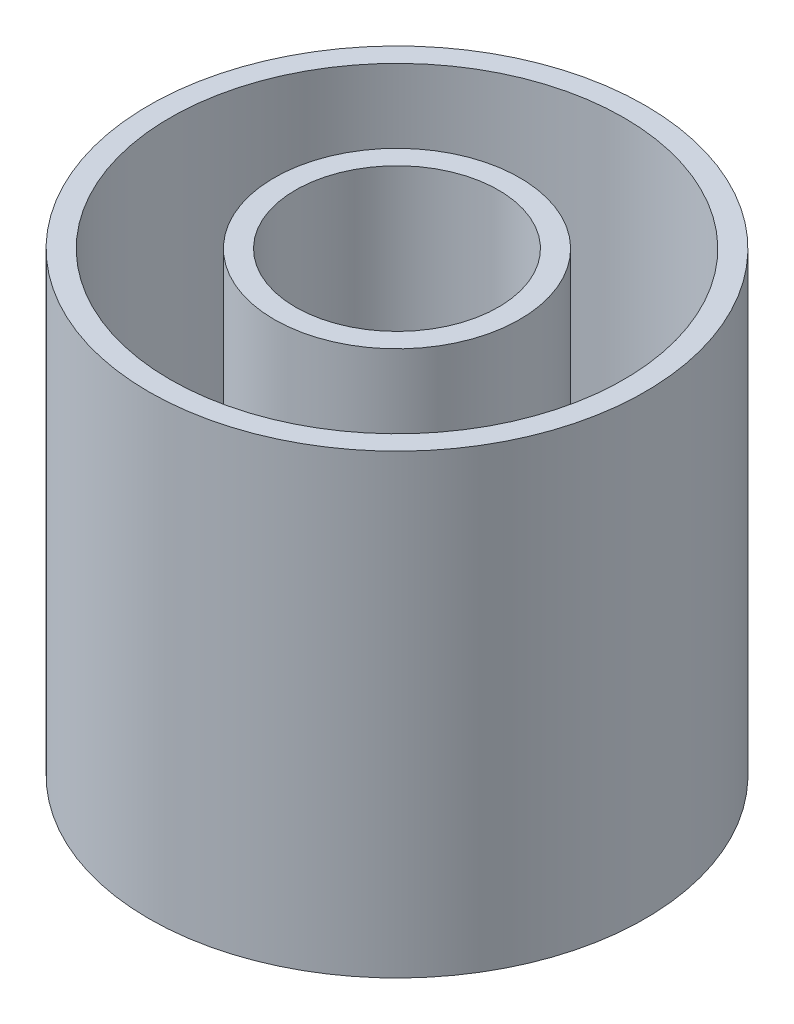
ISO-10303-21;
HEADER;
FILE_DESCRIPTION(('STEP AP214'),'2;1');
FILE_NAME('part.step','',(''),(''),'','','');
FILE_SCHEMA(('AUTOMOTIVE_DESIGN { 1 0 10303 214 1 1 1 1 }'));
ENDSEC;
DATA;
#1=APPLICATION_CONTEXT('core data for automotive mechanical design processes');
#2=APPLICATION_PROTOCOL_DEFINITION('international standard','automotive_design',2000,#1);
#3=PRODUCT_CONTEXT('',#1,'mechanical');
#4=PRODUCT('Part','Part','',(#3));
#5=PRODUCT_RELATED_PRODUCT_CATEGORY('part','',(#4));
#6=PRODUCT_DEFINITION_FORMATION('','',#4);
#7=PRODUCT_DEFINITION_CONTEXT('part definition',#1,'design');
#8=PRODUCT_DEFINITION('design','',#6,#7);
#9=PRODUCT_DEFINITION_SHAPE('','',#8);
#10=(LENGTH_UNIT() NAMED_UNIT(*) SI_UNIT(.MILLI.,.METRE.));
#11=(NAMED_UNIT(*) PLANE_ANGLE_UNIT() SI_UNIT($,.RADIAN.));
#12=(NAMED_UNIT(*) SI_UNIT($,.STERADIAN.) SOLID_ANGLE_UNIT());
#13=UNCERTAINTY_MEASURE_WITH_UNIT(LENGTH_MEASURE(1.E-05),#10,'distance_accuracy_value','');
#14=(GEOMETRIC_REPRESENTATION_CONTEXT(3) GLOBAL_UNCERTAINTY_ASSIGNED_CONTEXT((#13)) GLOBAL_UNIT_ASSIGNED_CONTEXT((#10,
#11,#12)) REPRESENTATION_CONTEXT('',''));
#15=CARTESIAN_POINT('',(0.,0.,0.));
#16=DIRECTION('',(0.,0.,1.));
#17=DIRECTION('',(1.,0.,0.));
#18=AXIS2_PLACEMENT_3D('',#15,#16,#17);
#19=CARTESIAN_POINT('',(0.,21.4122,0.));
#20=DIRECTION('',(0.,-1.,0.));
#21=DIRECTION('',(0.,0.,-1.));
#22=AXIS2_PLACEMENT_3D('',#19,#20,#21);
#23=CYLINDRICAL_SURFACE('',#22,11.6459);
#24=CARTESIAN_POINT('',(0.,21.4122,0.));
#25=DIRECTION('',(0.,1.,0.));
#26=DIRECTION('',(0.,0.,1.));
#27=AXIS2_PLACEMENT_3D('',#24,#25,#26);
#28=CIRCLE('',#27,11.6459);
#29=CARTESIAN_POINT('',(0.,21.4122,11.6459));
#30=VERTEX_POINT('',#29);
#31=EDGE_CURVE('E10',#30,#30,#28,.T.);
#32=ORIENTED_EDGE('',*,*,#31,.F.);
#33=EDGE_LOOP('',(#32));
#34=FACE_BOUND('',#33,.T.);
#35=CARTESIAN_POINT('',(0.,0.,0.));
#36=DIRECTION('',(0.,1.,0.));
#37=DIRECTION('',(0.,0.,1.));
#38=AXIS2_PLACEMENT_3D('',#35,#36,#37);
#39=CIRCLE('',#38,11.6459);
#40=CARTESIAN_POINT('',(0.,0.,11.6459));
#41=VERTEX_POINT('',#40);
#42=EDGE_CURVE('E36',#41,#41,#39,.T.);
#43=ORIENTED_EDGE('',*,*,#42,.T.);
#44=EDGE_LOOP('',(#43));
#45=FACE_BOUND('',#44,.T.);
#46=ADVANCED_FACE('F33',(#34,#45),#23,.T.);
#47=CARTESIAN_POINT('',(0.,21.4122,0.));
#48=DIRECTION('',(0.,1.,0.));
#49=DIRECTION('',(0.,0.,1.));
#50=AXIS2_PLACEMENT_3D('',#47,#48,#49);
#51=PLANE('',#50);
#52=CARTESIAN_POINT('',(0.,21.4122,0.));
#53=DIRECTION('',(0.,1.,0.));
#54=DIRECTION('',(0.,0.,1.));
#55=AXIS2_PLACEMENT_3D('',#52,#53,#54);
#56=CIRCLE('',#55,10.6459);
#57=CARTESIAN_POINT('',(0.,21.4122,10.6459));
#58=VERTEX_POINT('',#57);
#59=EDGE_CURVE('E51',#58,#58,#56,.T.);
#60=ORIENTED_EDGE('',*,*,#59,.F.);
#61=EDGE_LOOP('',(#60));
#62=FACE_BOUND('',#61,.T.);
#63=ORIENTED_EDGE('',*,*,#31,.T.);
#64=EDGE_LOOP('',(#63));
#65=FACE_BOUND('',#64,.T.);
#66=ADVANCED_FACE('F79',(#62,#65),#51,.T.);
#67=CARTESIAN_POINT('',(0.,0.,0.));
#68=DIRECTION('',(0.,1.,0.));
#69=DIRECTION('',(0.,0.,1.));
#70=AXIS2_PLACEMENT_3D('',#67,#68,#69);
#71=PLANE('',#70);
#72=ORIENTED_EDGE('',*,*,#42,.F.);
#73=EDGE_LOOP('',(#72));
#74=FACE_BOUND('',#73,.T.);
#75=ADVANCED_FACE('F75',(#74),#71,.F.);
#76=CARTESIAN_POINT('',(0.,1.,0.));
#77=DIRECTION('',(0.,1.,0.));
#78=DIRECTION('',(0.,0.,1.));
#79=AXIS2_PLACEMENT_3D('',#76,#77,#78);
#80=CYLINDRICAL_SURFACE('',#79,10.6459);
#81=CARTESIAN_POINT('',(0.,1.,0.));
#82=DIRECTION('',(0.,1.,0.));
#83=DIRECTION('',(0.,0.,1.));
#84=AXIS2_PLACEMENT_3D('',#81,#82,#83);
#85=CIRCLE('',#84,10.6459);
#86=CARTESIAN_POINT('',(0.,1.,10.6459));
#87=VERTEX_POINT('',#86);
#88=EDGE_CURVE('E48',#87,#87,#85,.T.);
#89=ORIENTED_EDGE('',*,*,#88,.F.);
#90=EDGE_LOOP('',(#89));
#91=FACE_BOUND('',#90,.T.);
#92=ORIENTED_EDGE('',*,*,#59,.T.);
#93=EDGE_LOOP('',(#92));
#94=FACE_BOUND('',#93,.T.);
#95=ADVANCED_FACE('F69',(#91,#94),#80,.F.);
#96=CARTESIAN_POINT('',(0.,1.,0.));
#97=DIRECTION('',(0.,1.,0.));
#98=DIRECTION('',(0.,0.,1.));
#99=AXIS2_PLACEMENT_3D('',#96,#97,#98);
#100=PLANE('',#99);
#101=CARTESIAN_POINT('',(0.,1.,0.));
#102=DIRECTION('',(0.,1.,0.));
#103=DIRECTION('',(0.,0.,1.));
#104=AXIS2_PLACEMENT_3D('',#101,#102,#103);
#105=CIRCLE('',#104,5.7625);
#106=CARTESIAN_POINT('',(0.,1.,5.7625));
#107=VERTEX_POINT('',#106);
#108=EDGE_CURVE('E54',#107,#107,#105,.T.);
#109=ORIENTED_EDGE('',*,*,#108,.F.);
#110=EDGE_LOOP('',(#109));
#111=FACE_BOUND('',#110,.T.);
#112=ORIENTED_EDGE('',*,*,#88,.T.);
#113=EDGE_LOOP('',(#112));
#114=FACE_BOUND('',#113,.T.);
#115=ADVANCED_FACE('F66',(#111,#114),#100,.T.);
#116=CARTESIAN_POINT('',(0.,1.,0.));
#117=DIRECTION('',(0.,1.,0.));
#118=DIRECTION('',(0.,0.,1.));
#119=AXIS2_PLACEMENT_3D('',#116,#117,#118);
#120=CYLINDRICAL_SURFACE('',#119,5.7625);
#121=ORIENTED_EDGE('',*,*,#108,.T.);
#122=EDGE_LOOP('',(#121));
#123=FACE_BOUND('',#122,.T.);
#124=CARTESIAN_POINT('',(0.,21.4122,0.));
#125=DIRECTION('',(0.,1.,0.));
#126=DIRECTION('',(0.,0.,1.));
#127=AXIS2_PLACEMENT_3D('',#124,#125,#126);
#128=CIRCLE('',#127,5.7625);
#129=CARTESIAN_POINT('',(0.,21.4122,5.7625));
#130=VERTEX_POINT('',#129);
#131=EDGE_CURVE('E57',#130,#130,#128,.T.);
#132=ORIENTED_EDGE('',*,*,#131,.F.);
#133=EDGE_LOOP('',(#132));
#134=FACE_BOUND('',#133,.T.);
#135=ADVANCED_FACE('F63',(#123,#134),#120,.T.);
#136=CARTESIAN_POINT('',(0.,1.4122,0.));
#137=DIRECTION('',(0.,1.,0.));
#138=DIRECTION('',(0.,0.,1.));
#139=AXIS2_PLACEMENT_3D('',#136,#137,#138);
#140=PLANE('',#139);
#141=CARTESIAN_POINT('',(0.,1.4122,0.));
#142=DIRECTION('',(0.,1.,0.));
#143=DIRECTION('',(0.,0.,1.));
#144=AXIS2_PLACEMENT_3D('',#141,#142,#143);
#145=CIRCLE('',#144,4.7625);
#146=CARTESIAN_POINT('',(0.,1.4122,4.7625));
#147=VERTEX_POINT('',#146);
#148=EDGE_CURVE('E43',#147,#147,#145,.T.);
#149=ORIENTED_EDGE('',*,*,#148,.T.);
#150=EDGE_LOOP('',(#149));
#151=FACE_BOUND('',#150,.T.);
#152=ADVANCED_FACE('F96',(#151),#140,.T.);
#153=CARTESIAN_POINT('',(0.,1.4122,0.));
#154=DIRECTION('',(0.,1.,0.));
#155=DIRECTION('',(0.,0.,1.));
#156=AXIS2_PLACEMENT_3D('',#153,#154,#155);
#157=CYLINDRICAL_SURFACE('',#156,4.7625);
#158=ORIENTED_EDGE('',*,*,#148,.F.);
#159=EDGE_LOOP('',(#158));
#160=FACE_BOUND('',#159,.T.);
#161=CARTESIAN_POINT('',(0.,21.4122,0.));
#162=DIRECTION('',(0.,1.,0.));
#163=DIRECTION('',(0.,0.,1.));
#164=AXIS2_PLACEMENT_3D('',#161,#162,#163);
#165=CIRCLE('',#164,4.7625);
#166=CARTESIAN_POINT('',(0.,21.4122,4.7625));
#167=VERTEX_POINT('',#166);
#168=EDGE_CURVE('E45',#167,#167,#165,.T.);
#169=ORIENTED_EDGE('',*,*,#168,.T.);
#170=EDGE_LOOP('',(#169));
#171=FACE_BOUND('',#170,.T.);
#172=ADVANCED_FACE('F91',(#160,#171),#157,.F.);
#173=ORIENTED_EDGE('',*,*,#168,.F.);
#174=EDGE_LOOP('',(#173));
#175=FACE_BOUND('',#174,.T.);
#176=ORIENTED_EDGE('',*,*,#131,.T.);
#177=EDGE_LOOP('',(#176));
#178=FACE_BOUND('',#177,.T.);
#179=ADVANCED_FACE('F82',(#175,#178),#51,.T.);
#180=CLOSED_SHELL('',(#46,#66,#75,#95,#115,#135,#152,#172,#179));
#181=MANIFOLD_SOLID_BREP('B2',#180);
#182=ADVANCED_BREP_SHAPE_REPRESENTATION('',(#18,#181),#14);
#183=SHAPE_DEFINITION_REPRESENTATION(#9,#182);
ENDSEC;
END-ISO-10303-21;
